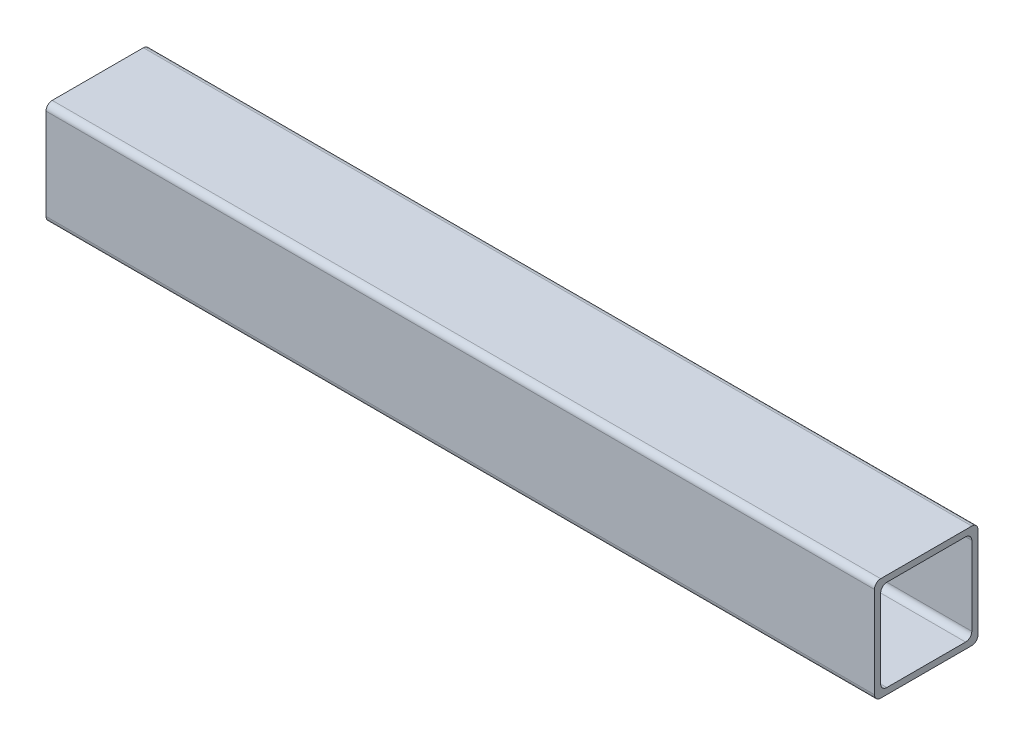
ISO-10303-21;
HEADER;
FILE_DESCRIPTION(('STEP AP214'),'2;1');
FILE_NAME('part.step','',(''),(''),'','','');
FILE_SCHEMA(('AUTOMOTIVE_DESIGN { 1 0 10303 214 1 1 1 1 }'));
ENDSEC;
DATA;
#1=APPLICATION_CONTEXT('core data for automotive mechanical design processes');
#2=APPLICATION_PROTOCOL_DEFINITION('international standard','automotive_design',2000,#1);
#3=PRODUCT_CONTEXT('',#1,'mechanical');
#4=PRODUCT('Part','Part','',(#3));
#5=PRODUCT_RELATED_PRODUCT_CATEGORY('part','',(#4));
#6=PRODUCT_DEFINITION_FORMATION('','',#4);
#7=PRODUCT_DEFINITION_CONTEXT('part definition',#1,'design');
#8=PRODUCT_DEFINITION('design','',#6,#7);
#9=PRODUCT_DEFINITION_SHAPE('','',#8);
#10=(LENGTH_UNIT() NAMED_UNIT(*) SI_UNIT(.MILLI.,.METRE.));
#11=(NAMED_UNIT(*) PLANE_ANGLE_UNIT() SI_UNIT($,.RADIAN.));
#12=(NAMED_UNIT(*) SI_UNIT($,.STERADIAN.) SOLID_ANGLE_UNIT());
#13=UNCERTAINTY_MEASURE_WITH_UNIT(LENGTH_MEASURE(1.E-05),#10,'distance_accuracy_value','');
#14=(GEOMETRIC_REPRESENTATION_CONTEXT(3) GLOBAL_UNCERTAINTY_ASSIGNED_CONTEXT((#13)) GLOBAL_UNIT_ASSIGNED_CONTEXT((#10,
#11,#12)) REPRESENTATION_CONTEXT('',''));
#15=CARTESIAN_POINT('',(0.,0.,0.));
#16=DIRECTION('',(0.,0.,1.));
#17=DIRECTION('',(1.,0.,0.));
#18=AXIS2_PLACEMENT_3D('',#15,#16,#17);
#19=CARTESIAN_POINT('',(200.,23.5,-23.5));
#20=DIRECTION('',(-1.,0.,0.));
#21=DIRECTION('',(0.,0.,1.));
#22=AXIS2_PLACEMENT_3D('',#19,#20,#21);
#23=PLANE('',#22);
#24=CARTESIAN_POINT('',(200.,23.5,-23.5));
#25=DIRECTION('',(1.,0.,0.));
#26=DIRECTION('',(0.,0.,1.));
#27=AXIS2_PLACEMENT_3D('',#24,#25,#26);
#28=CIRCLE('',#27,1.5);
#29=CARTESIAN_POINT('',(200.,23.5,-25.));
#30=VERTEX_POINT('',#29);
#31=CARTESIAN_POINT('',(200.,25.,-23.5));
#32=VERTEX_POINT('',#31);
#33=EDGE_CURVE('E211',#30,#32,#28,.T.);
#34=ORIENTED_EDGE('',*,*,#33,.T.);
#35=DIRECTION('',(0.,0.,1.));
#36=VECTOR('',#35,1.);
#37=CARTESIAN_POINT('',(200.,25.,-1.50000000000001));
#38=LINE('',#37,#36);
#39=CARTESIAN_POINT('',(200.,25.,-1.50000000000001));
#40=VERTEX_POINT('',#39);
#41=EDGE_CURVE('E214',#32,#40,#38,.T.);
#42=ORIENTED_EDGE('',*,*,#41,.T.);
#43=CARTESIAN_POINT('',(200.,23.5,-1.5));
#44=DIRECTION('',(1.,0.,0.));
#45=DIRECTION('',(0.,0.,1.));
#46=AXIS2_PLACEMENT_3D('',#43,#44,#45);
#47=CIRCLE('',#46,1.5);
#48=CARTESIAN_POINT('',(200.,23.5,0.));
#49=VERTEX_POINT('',#48);
#50=EDGE_CURVE('E217',#40,#49,#47,.T.);
#51=ORIENTED_EDGE('',*,*,#50,.T.);
#52=DIRECTION('',(0.,-1.,0.));
#53=VECTOR('',#52,1.);
#54=CARTESIAN_POINT('',(200.,1.50000000000001,0.));
#55=LINE('',#54,#53);
#56=CARTESIAN_POINT('',(200.,1.50000000000001,0.));
#57=VERTEX_POINT('',#56);
#58=EDGE_CURVE('E219',#49,#57,#55,.T.);
#59=ORIENTED_EDGE('',*,*,#58,.T.);
#60=CARTESIAN_POINT('',(200.,1.5,-1.5));
#61=DIRECTION('',(1.,0.,0.));
#62=DIRECTION('',(0.,0.,1.));
#63=AXIS2_PLACEMENT_3D('',#60,#61,#62);
#64=CIRCLE('',#63,1.5);
#65=CARTESIAN_POINT('',(200.,0.,-1.50000000000001));
#66=VERTEX_POINT('',#65);
#67=EDGE_CURVE('E221',#57,#66,#64,.T.);
#68=ORIENTED_EDGE('',*,*,#67,.T.);
#69=DIRECTION('',(0.,0.,-1.));
#70=VECTOR('',#69,1.);
#71=CARTESIAN_POINT('',(200.,0.,-1.50000000000001));
#72=LINE('',#71,#70);
#73=CARTESIAN_POINT('',(200.,0.,-23.5));
#74=VERTEX_POINT('',#73);
#75=EDGE_CURVE('E223',#66,#74,#72,.T.);
#76=ORIENTED_EDGE('',*,*,#75,.T.);
#77=CARTESIAN_POINT('',(200.,1.5,-23.5));
#78=DIRECTION('',(1.,0.,0.));
#79=DIRECTION('',(0.,0.,-1.));
#80=AXIS2_PLACEMENT_3D('',#77,#78,#79);
#81=CIRCLE('',#80,1.5);
#82=CARTESIAN_POINT('',(200.,1.5,-25.));
#83=VERTEX_POINT('',#82);
#84=EDGE_CURVE('E225',#74,#83,#81,.T.);
#85=ORIENTED_EDGE('',*,*,#84,.T.);
#86=DIRECTION('',(0.,1.,0.));
#87=VECTOR('',#86,1.);
#88=CARTESIAN_POINT('',(200.,1.50000000000001,-25.));
#89=LINE('',#88,#87);
#90=EDGE_CURVE('E227',#83,#30,#89,.T.);
#91=ORIENTED_EDGE('',*,*,#90,.T.);
#92=EDGE_LOOP('',(#34,#42,#51,#59,#68,#76,#85,#91));
#93=FACE_BOUND('',#92,.T.);
#94=CARTESIAN_POINT('',(200.,22.,-22.));
#95=DIRECTION('',(1.,0.,0.));
#96=DIRECTION('',(0.,0.,1.));
#97=AXIS2_PLACEMENT_3D('',#94,#95,#96);
#98=CIRCLE('',#97,1.5);
#99=CARTESIAN_POINT('',(200.,22.,-23.5));
#100=VERTEX_POINT('',#99);
#101=CARTESIAN_POINT('',(200.,23.5,-22.));
#102=VERTEX_POINT('',#101);
#103=EDGE_CURVE('E146',#100,#102,#98,.T.);
#104=ORIENTED_EDGE('',*,*,#103,.F.);
#105=DIRECTION('',(0.,1.,0.));
#106=VECTOR('',#105,1.);
#107=CARTESIAN_POINT('',(200.,22.,-23.5));
#108=LINE('',#107,#106);
#109=CARTESIAN_POINT('',(200.,3.,-23.5));
#110=VERTEX_POINT('',#109);
#111=EDGE_CURVE('E179',#110,#100,#108,.T.);
#112=ORIENTED_EDGE('',*,*,#111,.F.);
#113=CARTESIAN_POINT('',(200.,3.,-22.));
#114=DIRECTION('',(1.,0.,0.));
#115=DIRECTION('',(0.,0.,-1.));
#116=AXIS2_PLACEMENT_3D('',#113,#114,#115);
#117=CIRCLE('',#116,1.5);
#118=CARTESIAN_POINT('',(200.,1.5,-22.));
#119=VERTEX_POINT('',#118);
#120=EDGE_CURVE('E177',#119,#110,#117,.T.);
#121=ORIENTED_EDGE('',*,*,#120,.F.);
#122=DIRECTION('',(0.,0.,-1.));
#123=VECTOR('',#122,1.);
#124=CARTESIAN_POINT('',(200.,1.5,-3.00000000000001));
#125=LINE('',#124,#123);
#126=CARTESIAN_POINT('',(200.,1.5,-3.00000000000001));
#127=VERTEX_POINT('',#126);
#128=EDGE_CURVE('E175',#127,#119,#125,.T.);
#129=ORIENTED_EDGE('',*,*,#128,.F.);
#130=CARTESIAN_POINT('',(200.,3.,-3.));
#131=DIRECTION('',(1.,0.,0.));
#132=DIRECTION('',(0.,0.,-1.));
#133=AXIS2_PLACEMENT_3D('',#130,#131,#132);
#134=CIRCLE('',#133,1.5);
#135=CARTESIAN_POINT('',(200.,3.00000000000001,-1.5));
#136=VERTEX_POINT('',#135);
#137=EDGE_CURVE('E173',#136,#127,#134,.T.);
#138=ORIENTED_EDGE('',*,*,#137,.F.);
#139=DIRECTION('',(0.,-1.,0.));
#140=VECTOR('',#139,1.);
#141=CARTESIAN_POINT('',(200.,22.,-1.5));
#142=LINE('',#141,#140);
#143=CARTESIAN_POINT('',(200.,22.,-1.5));
#144=VERTEX_POINT('',#143);
#145=EDGE_CURVE('E169',#144,#136,#142,.T.);
#146=ORIENTED_EDGE('',*,*,#145,.F.);
#147=CARTESIAN_POINT('',(200.,22.,-3.));
#148=DIRECTION('',(1.,0.,0.));
#149=DIRECTION('',(0.,0.,1.));
#150=AXIS2_PLACEMENT_3D('',#147,#148,#149);
#151=CIRCLE('',#150,1.5);
#152=CARTESIAN_POINT('',(200.,23.5,-3.00000000000001));
#153=VERTEX_POINT('',#152);
#154=EDGE_CURVE('E167',#153,#144,#151,.T.);
#155=ORIENTED_EDGE('',*,*,#154,.F.);
#156=DIRECTION('',(0.,0.,1.));
#157=VECTOR('',#156,1.);
#158=CARTESIAN_POINT('',(200.,23.5,-3.00000000000001));
#159=LINE('',#158,#157);
#160=EDGE_CURVE('E154',#102,#153,#159,.T.);
#161=ORIENTED_EDGE('',*,*,#160,.F.);
#162=EDGE_LOOP('',(#104,#112,#121,#129,#138,#146,#155,#161));
#163=FACE_BOUND('',#162,.T.);
#164=ADVANCED_FACE('F33',(#93,#163),#23,.F.);
#165=CARTESIAN_POINT('',(0.,23.5,-23.5));
#166=DIRECTION('',(-1.,0.,0.));
#167=DIRECTION('',(0.,0.,1.));
#168=AXIS2_PLACEMENT_3D('',#165,#166,#167);
#169=PLANE('',#168);
#170=CARTESIAN_POINT('',(0.,23.5,-23.5));
#171=DIRECTION('',(1.,0.,0.));
#172=DIRECTION('',(0.,0.,1.));
#173=AXIS2_PLACEMENT_3D('',#170,#171,#172);
#174=CIRCLE('',#173,1.5);
#175=CARTESIAN_POINT('',(0.,23.5,-25.));
#176=VERTEX_POINT('',#175);
#177=CARTESIAN_POINT('',(0.,25.,-23.5));
#178=VERTEX_POINT('',#177);
#179=EDGE_CURVE('E162',#176,#178,#174,.T.);
#180=ORIENTED_EDGE('',*,*,#179,.F.);
#181=DIRECTION('',(0.,1.,0.));
#182=VECTOR('',#181,1.);
#183=CARTESIAN_POINT('',(0.,1.50000000000001,-25.));
#184=LINE('',#183,#182);
#185=CARTESIAN_POINT('',(0.,1.5,-25.));
#186=VERTEX_POINT('',#185);
#187=EDGE_CURVE('E215',#186,#176,#184,.T.);
#188=ORIENTED_EDGE('',*,*,#187,.F.);
#189=CARTESIAN_POINT('',(0.,1.5,-23.5));
#190=DIRECTION('',(1.,0.,0.));
#191=DIRECTION('',(0.,0.,-1.));
#192=AXIS2_PLACEMENT_3D('',#189,#190,#191);
#193=CIRCLE('',#192,1.5);
#194=CARTESIAN_POINT('',(0.,0.,-23.5));
#195=VERTEX_POINT('',#194);
#196=EDGE_CURVE('E242',#195,#186,#193,.T.);
#197=ORIENTED_EDGE('',*,*,#196,.F.);
#198=DIRECTION('',(0.,0.,-1.));
#199=VECTOR('',#198,1.);
#200=CARTESIAN_POINT('',(0.,0.,-1.50000000000001));
#201=LINE('',#200,#199);
#202=CARTESIAN_POINT('',(0.,0.,-1.50000000000001));
#203=VERTEX_POINT('',#202);
#204=EDGE_CURVE('E240',#203,#195,#201,.T.);
#205=ORIENTED_EDGE('',*,*,#204,.F.);
#206=CARTESIAN_POINT('',(0.,1.5,-1.5));
#207=DIRECTION('',(1.,0.,0.));
#208=DIRECTION('',(0.,0.,1.));
#209=AXIS2_PLACEMENT_3D('',#206,#207,#208);
#210=CIRCLE('',#209,1.5);
#211=CARTESIAN_POINT('',(0.,1.50000000000001,0.));
#212=VERTEX_POINT('',#211);
#213=EDGE_CURVE('E238',#212,#203,#210,.T.);
#214=ORIENTED_EDGE('',*,*,#213,.F.);
#215=DIRECTION('',(0.,-1.,0.));
#216=VECTOR('',#215,1.);
#217=CARTESIAN_POINT('',(0.,1.50000000000001,0.));
#218=LINE('',#217,#216);
#219=CARTESIAN_POINT('',(0.,23.5,0.));
#220=VERTEX_POINT('',#219);
#221=EDGE_CURVE('E236',#220,#212,#218,.T.);
#222=ORIENTED_EDGE('',*,*,#221,.F.);
#223=CARTESIAN_POINT('',(0.,23.5,-1.5));
#224=DIRECTION('',(1.,0.,0.));
#225=DIRECTION('',(0.,0.,1.));
#226=AXIS2_PLACEMENT_3D('',#223,#224,#225);
#227=CIRCLE('',#226,1.5);
#228=CARTESIAN_POINT('',(0.,25.,-1.50000000000001));
#229=VERTEX_POINT('',#228);
#230=EDGE_CURVE('E234',#229,#220,#227,.T.);
#231=ORIENTED_EDGE('',*,*,#230,.F.);
#232=DIRECTION('',(0.,0.,1.));
#233=VECTOR('',#232,1.);
#234=CARTESIAN_POINT('',(0.,25.,-1.50000000000001));
#235=LINE('',#234,#233);
#236=EDGE_CURVE('E232',#178,#229,#235,.T.);
#237=ORIENTED_EDGE('',*,*,#236,.F.);
#238=EDGE_LOOP('',(#180,#188,#197,#205,#214,#222,#231,#237));
#239=FACE_BOUND('',#238,.T.);
#240=DIRECTION('',(0.,1.,0.));
#241=VECTOR('',#240,1.);
#242=CARTESIAN_POINT('',(0.,22.,-23.5));
#243=LINE('',#242,#241);
#244=CARTESIAN_POINT('',(0.,3.,-23.5));
#245=VERTEX_POINT('',#244);
#246=CARTESIAN_POINT('',(0.,22.,-23.5));
#247=VERTEX_POINT('',#246);
#248=EDGE_CURVE('E155',#245,#247,#243,.T.);
#249=ORIENTED_EDGE('',*,*,#248,.T.);
#250=CARTESIAN_POINT('',(0.,22.,-22.));
#251=DIRECTION('',(1.,0.,0.));
#252=DIRECTION('',(0.,0.,1.));
#253=AXIS2_PLACEMENT_3D('',#250,#251,#252);
#254=CIRCLE('',#253,1.5);
#255=CARTESIAN_POINT('',(0.,23.5,-22.));
#256=VERTEX_POINT('',#255);
#257=EDGE_CURVE('E56',#247,#256,#254,.T.);
#258=ORIENTED_EDGE('',*,*,#257,.T.);
#259=DIRECTION('',(0.,0.,1.));
#260=VECTOR('',#259,1.);
#261=CARTESIAN_POINT('',(0.,23.5,-3.00000000000001));
#262=LINE('',#261,#260);
#263=CARTESIAN_POINT('',(0.,23.5,-3.00000000000001));
#264=VERTEX_POINT('',#263);
#265=EDGE_CURVE('E161',#256,#264,#262,.T.);
#266=ORIENTED_EDGE('',*,*,#265,.T.);
#267=CARTESIAN_POINT('',(0.,22.,-3.));
#268=DIRECTION('',(1.,0.,0.));
#269=DIRECTION('',(0.,0.,1.));
#270=AXIS2_PLACEMENT_3D('',#267,#268,#269);
#271=CIRCLE('',#270,1.5);
#272=CARTESIAN_POINT('',(0.,22.,-1.5));
#273=VERTEX_POINT('',#272);
#274=EDGE_CURVE('E183',#264,#273,#271,.T.);
#275=ORIENTED_EDGE('',*,*,#274,.T.);
#276=DIRECTION('',(0.,-1.,0.));
#277=VECTOR('',#276,1.);
#278=CARTESIAN_POINT('',(0.,22.,-1.5));
#279=LINE('',#278,#277);
#280=CARTESIAN_POINT('',(0.,3.00000000000001,-1.5));
#281=VERTEX_POINT('',#280);
#282=EDGE_CURVE('E186',#273,#281,#279,.T.);
#283=ORIENTED_EDGE('',*,*,#282,.T.);
#284=CARTESIAN_POINT('',(0.,3.,-3.));
#285=DIRECTION('',(1.,0.,0.));
#286=DIRECTION('',(0.,0.,-1.));
#287=AXIS2_PLACEMENT_3D('',#284,#285,#286);
#288=CIRCLE('',#287,1.5);
#289=CARTESIAN_POINT('',(0.,1.5,-3.00000000000001));
#290=VERTEX_POINT('',#289);
#291=EDGE_CURVE('E189',#281,#290,#288,.T.);
#292=ORIENTED_EDGE('',*,*,#291,.T.);
#293=DIRECTION('',(0.,0.,-1.));
#294=VECTOR('',#293,1.);
#295=CARTESIAN_POINT('',(0.,1.5,-3.00000000000001));
#296=LINE('',#295,#294);
#297=CARTESIAN_POINT('',(0.,1.5,-22.));
#298=VERTEX_POINT('',#297);
#299=EDGE_CURVE('E192',#290,#298,#296,.T.);
#300=ORIENTED_EDGE('',*,*,#299,.T.);
#301=CARTESIAN_POINT('',(0.,3.,-22.));
#302=DIRECTION('',(1.,0.,0.));
#303=DIRECTION('',(0.,0.,-1.));
#304=AXIS2_PLACEMENT_3D('',#301,#302,#303);
#305=CIRCLE('',#304,1.5);
#306=EDGE_CURVE('E195',#298,#245,#305,.T.);
#307=ORIENTED_EDGE('',*,*,#306,.T.);
#308=EDGE_LOOP('',(#249,#258,#266,#275,#283,#292,#300,#307));
#309=FACE_BOUND('',#308,.T.);
#310=ADVANCED_FACE('F272',(#239,#309),#169,.T.);
#311=CARTESIAN_POINT('',(200.,23.5,-23.5));
#312=DIRECTION('',(-1.,0.,0.));
#313=DIRECTION('',(0.,0.,1.));
#314=AXIS2_PLACEMENT_3D('',#311,#312,#313);
#315=CYLINDRICAL_SURFACE('',#314,1.5);
#316=ORIENTED_EDGE('',*,*,#179,.T.);
#317=DIRECTION('',(-1.,0.,0.));
#318=VECTOR('',#317,1.);
#319=CARTESIAN_POINT('',(200.,25.,-23.5));
#320=LINE('',#319,#318);
#321=EDGE_CURVE('E11',#32,#178,#320,.T.);
#322=ORIENTED_EDGE('',*,*,#321,.F.);
#323=ORIENTED_EDGE('',*,*,#33,.F.);
#324=DIRECTION('',(-1.,0.,0.));
#325=VECTOR('',#324,1.);
#326=CARTESIAN_POINT('',(200.,23.5,-25.));
#327=LINE('',#326,#325);
#328=EDGE_CURVE('E229',#30,#176,#327,.T.);
#329=ORIENTED_EDGE('',*,*,#328,.T.);
#330=EDGE_LOOP('',(#316,#322,#323,#329));
#331=FACE_BOUND('',#330,.T.);
#332=ADVANCED_FACE('F35',(#331),#315,.T.);
#333=CARTESIAN_POINT('',(200.,25.,-1.50000000000001));
#334=DIRECTION('',(0.,-1.,0.));
#335=DIRECTION('',(0.,0.,-1.));
#336=AXIS2_PLACEMENT_3D('',#333,#334,#335);
#337=PLANE('',#336);
#338=ORIENTED_EDGE('',*,*,#236,.T.);
#339=DIRECTION('',(-1.,0.,0.));
#340=VECTOR('',#339,1.);
#341=CARTESIAN_POINT('',(200.,25.,-1.50000000000001));
#342=LINE('',#341,#340);
#343=EDGE_CURVE('E41',#40,#229,#342,.T.);
#344=ORIENTED_EDGE('',*,*,#343,.F.);
#345=ORIENTED_EDGE('',*,*,#41,.F.);
#346=ORIENTED_EDGE('',*,*,#321,.T.);
#347=EDGE_LOOP('',(#338,#344,#345,#346));
#348=FACE_BOUND('',#347,.T.);
#349=ADVANCED_FACE('F289',(#348),#337,.F.);
#350=CARTESIAN_POINT('',(200.,23.5,-1.5));
#351=DIRECTION('',(-1.,0.,0.));
#352=DIRECTION('',(0.,0.,1.));
#353=AXIS2_PLACEMENT_3D('',#350,#351,#352);
#354=CYLINDRICAL_SURFACE('',#353,1.5);
#355=ORIENTED_EDGE('',*,*,#230,.T.);
#356=DIRECTION('',(-1.,0.,0.));
#357=VECTOR('',#356,1.);
#358=CARTESIAN_POINT('',(200.,23.5,0.));
#359=LINE('',#358,#357);
#360=EDGE_CURVE('E259',#49,#220,#359,.T.);
#361=ORIENTED_EDGE('',*,*,#360,.F.);
#362=ORIENTED_EDGE('',*,*,#50,.F.);
#363=ORIENTED_EDGE('',*,*,#343,.T.);
#364=EDGE_LOOP('',(#355,#361,#362,#363));
#365=FACE_BOUND('',#364,.T.);
#366=ADVANCED_FACE('F266',(#365),#354,.T.);
#367=CARTESIAN_POINT('',(200.,1.50000000000001,0.));
#368=DIRECTION('',(0.,0.,-1.));
#369=DIRECTION('',(-1.,0.,0.));
#370=AXIS2_PLACEMENT_3D('',#367,#368,#369);
#371=PLANE('',#370);
#372=ORIENTED_EDGE('',*,*,#221,.T.);
#373=DIRECTION('',(-1.,0.,0.));
#374=VECTOR('',#373,1.);
#375=CARTESIAN_POINT('',(200.,1.50000000000001,0.));
#376=LINE('',#375,#374);
#377=EDGE_CURVE('E256',#57,#212,#376,.T.);
#378=ORIENTED_EDGE('',*,*,#377,.F.);
#379=ORIENTED_EDGE('',*,*,#58,.F.);
#380=ORIENTED_EDGE('',*,*,#360,.T.);
#381=EDGE_LOOP('',(#372,#378,#379,#380));
#382=FACE_BOUND('',#381,.T.);
#383=ADVANCED_FACE('F278',(#382),#371,.F.);
#384=CARTESIAN_POINT('',(200.,1.5,-1.5));
#385=DIRECTION('',(-1.,0.,0.));
#386=DIRECTION('',(0.,0.,1.));
#387=AXIS2_PLACEMENT_3D('',#384,#385,#386);
#388=CYLINDRICAL_SURFACE('',#387,1.5);
#389=ORIENTED_EDGE('',*,*,#213,.T.);
#390=DIRECTION('',(-1.,0.,0.));
#391=VECTOR('',#390,1.);
#392=CARTESIAN_POINT('',(200.,0.,-1.50000000000001));
#393=LINE('',#392,#391);
#394=EDGE_CURVE('E253',#66,#203,#393,.T.);
#395=ORIENTED_EDGE('',*,*,#394,.F.);
#396=ORIENTED_EDGE('',*,*,#67,.F.);
#397=ORIENTED_EDGE('',*,*,#377,.T.);
#398=EDGE_LOOP('',(#389,#395,#396,#397));
#399=FACE_BOUND('',#398,.T.);
#400=ADVANCED_FACE('F282',(#399),#388,.T.);
#401=CARTESIAN_POINT('',(200.,0.,-1.50000000000001));
#402=DIRECTION('',(0.,1.,0.));
#403=DIRECTION('',(0.,0.,1.));
#404=AXIS2_PLACEMENT_3D('',#401,#402,#403);
#405=PLANE('',#404);
#406=ORIENTED_EDGE('',*,*,#204,.T.);
#407=DIRECTION('',(-1.,0.,0.));
#408=VECTOR('',#407,1.);
#409=CARTESIAN_POINT('',(200.,0.,-23.5));
#410=LINE('',#409,#408);
#411=EDGE_CURVE('E250',#74,#195,#410,.T.);
#412=ORIENTED_EDGE('',*,*,#411,.F.);
#413=ORIENTED_EDGE('',*,*,#75,.F.);
#414=ORIENTED_EDGE('',*,*,#394,.T.);
#415=EDGE_LOOP('',(#406,#412,#413,#414));
#416=FACE_BOUND('',#415,.T.);
#417=ADVANCED_FACE('F302',(#416),#405,.F.);
#418=CARTESIAN_POINT('',(200.,1.5,-23.5));
#419=DIRECTION('',(-1.,0.,0.));
#420=DIRECTION('',(0.,0.,1.));
#421=AXIS2_PLACEMENT_3D('',#418,#419,#420);
#422=CYLINDRICAL_SURFACE('',#421,1.5);
#423=ORIENTED_EDGE('',*,*,#196,.T.);
#424=DIRECTION('',(-1.,0.,0.));
#425=VECTOR('',#424,1.);
#426=CARTESIAN_POINT('',(200.,1.5,-25.));
#427=LINE('',#426,#425);
#428=EDGE_CURVE('E247',#83,#186,#427,.T.);
#429=ORIENTED_EDGE('',*,*,#428,.F.);
#430=ORIENTED_EDGE('',*,*,#84,.F.);
#431=ORIENTED_EDGE('',*,*,#411,.T.);
#432=EDGE_LOOP('',(#423,#429,#430,#431));
#433=FACE_BOUND('',#432,.T.);
#434=ADVANCED_FACE('F300',(#433),#422,.T.);
#435=CARTESIAN_POINT('',(200.,1.50000000000001,-25.));
#436=DIRECTION('',(0.,0.,1.));
#437=DIRECTION('',(1.,0.,0.));
#438=AXIS2_PLACEMENT_3D('',#435,#436,#437);
#439=PLANE('',#438);
#440=ORIENTED_EDGE('',*,*,#187,.T.);
#441=ORIENTED_EDGE('',*,*,#328,.F.);
#442=ORIENTED_EDGE('',*,*,#90,.F.);
#443=ORIENTED_EDGE('',*,*,#428,.T.);
#444=EDGE_LOOP('',(#440,#441,#442,#443));
#445=FACE_BOUND('',#444,.T.);
#446=ADVANCED_FACE('F295',(#445),#439,.F.);
#447=CARTESIAN_POINT('',(200.,22.,-22.));
#448=DIRECTION('',(-1.,0.,0.));
#449=DIRECTION('',(0.,0.,1.));
#450=AXIS2_PLACEMENT_3D('',#447,#448,#449);
#451=CYLINDRICAL_SURFACE('',#450,1.5);
#452=ORIENTED_EDGE('',*,*,#257,.F.);
#453=DIRECTION('',(-1.,0.,0.));
#454=VECTOR('',#453,1.);
#455=CARTESIAN_POINT('',(200.,22.,-23.5));
#456=LINE('',#455,#454);
#457=EDGE_CURVE('E150',#100,#247,#456,.T.);
#458=ORIENTED_EDGE('',*,*,#457,.F.);
#459=ORIENTED_EDGE('',*,*,#103,.T.);
#460=DIRECTION('',(-1.,0.,0.));
#461=VECTOR('',#460,1.);
#462=CARTESIAN_POINT('',(200.,23.5,-22.));
#463=LINE('',#462,#461);
#464=EDGE_CURVE('E149',#102,#256,#463,.T.);
#465=ORIENTED_EDGE('',*,*,#464,.T.);
#466=EDGE_LOOP('',(#452,#458,#459,#465));
#467=FACE_BOUND('',#466,.T.);
#468=ADVANCED_FACE('F148',(#467),#451,.F.);
#469=CARTESIAN_POINT('',(200.,23.5,-3.00000000000001));
#470=DIRECTION('',(0.,-1.,0.));
#471=DIRECTION('',(0.,0.,-1.));
#472=AXIS2_PLACEMENT_3D('',#469,#470,#471);
#473=PLANE('',#472);
#474=ORIENTED_EDGE('',*,*,#265,.F.);
#475=ORIENTED_EDGE('',*,*,#464,.F.);
#476=ORIENTED_EDGE('',*,*,#160,.T.);
#477=DIRECTION('',(-1.,0.,0.));
#478=VECTOR('',#477,1.);
#479=CARTESIAN_POINT('',(200.,23.5,-3.00000000000001));
#480=LINE('',#479,#478);
#481=EDGE_CURVE('E163',#153,#264,#480,.T.);
#482=ORIENTED_EDGE('',*,*,#481,.T.);
#483=EDGE_LOOP('',(#474,#475,#476,#482));
#484=FACE_BOUND('',#483,.T.);
#485=ADVANCED_FACE('F158',(#484),#473,.T.);
#486=CARTESIAN_POINT('',(200.,22.,-3.));
#487=DIRECTION('',(-1.,0.,0.));
#488=DIRECTION('',(0.,0.,1.));
#489=AXIS2_PLACEMENT_3D('',#486,#487,#488);
#490=CYLINDRICAL_SURFACE('',#489,1.5);
#491=ORIENTED_EDGE('',*,*,#274,.F.);
#492=ORIENTED_EDGE('',*,*,#481,.F.);
#493=ORIENTED_EDGE('',*,*,#154,.T.);
#494=DIRECTION('',(-1.,0.,0.));
#495=VECTOR('',#494,1.);
#496=CARTESIAN_POINT('',(200.,22.,-1.5));
#497=LINE('',#496,#495);
#498=EDGE_CURVE('E208',#144,#273,#497,.T.);
#499=ORIENTED_EDGE('',*,*,#498,.T.);
#500=EDGE_LOOP('',(#491,#492,#493,#499));
#501=FACE_BOUND('',#500,.T.);
#502=ADVANCED_FACE('F327',(#501),#490,.F.);
#503=CARTESIAN_POINT('',(200.,22.,-1.5));
#504=DIRECTION('',(0.,0.,-1.));
#505=DIRECTION('',(0.,1.,0.));
#506=AXIS2_PLACEMENT_3D('',#503,#504,#505);
#507=PLANE('',#506);
#508=ORIENTED_EDGE('',*,*,#282,.F.);
#509=ORIENTED_EDGE('',*,*,#498,.F.);
#510=ORIENTED_EDGE('',*,*,#145,.T.);
#511=DIRECTION('',(-1.,0.,0.));
#512=VECTOR('',#511,1.);
#513=CARTESIAN_POINT('',(200.,3.00000000000001,-1.5));
#514=LINE('',#513,#512);
#515=EDGE_CURVE('E206',#136,#281,#514,.T.);
#516=ORIENTED_EDGE('',*,*,#515,.T.);
#517=EDGE_LOOP('',(#508,#509,#510,#516));
#518=FACE_BOUND('',#517,.T.);
#519=ADVANCED_FACE('F331',(#518),#507,.T.);
#520=CARTESIAN_POINT('',(200.,3.,-3.));
#521=DIRECTION('',(-1.,0.,0.));
#522=DIRECTION('',(0.,0.,1.));
#523=AXIS2_PLACEMENT_3D('',#520,#521,#522);
#524=CYLINDRICAL_SURFACE('',#523,1.5);
#525=ORIENTED_EDGE('',*,*,#291,.F.);
#526=ORIENTED_EDGE('',*,*,#515,.F.);
#527=ORIENTED_EDGE('',*,*,#137,.T.);
#528=DIRECTION('',(-1.,0.,0.));
#529=VECTOR('',#528,1.);
#530=CARTESIAN_POINT('',(200.,1.5,-3.00000000000001));
#531=LINE('',#530,#529);
#532=EDGE_CURVE('E204',#127,#290,#531,.T.);
#533=ORIENTED_EDGE('',*,*,#532,.T.);
#534=EDGE_LOOP('',(#525,#526,#527,#533));
#535=FACE_BOUND('',#534,.T.);
#536=ADVANCED_FACE('F337',(#535),#524,.F.);
#537=CARTESIAN_POINT('',(200.,1.5,-3.00000000000001));
#538=DIRECTION('',(0.,1.,0.));
#539=DIRECTION('',(0.,0.,1.));
#540=AXIS2_PLACEMENT_3D('',#537,#538,#539);
#541=PLANE('',#540);
#542=ORIENTED_EDGE('',*,*,#299,.F.);
#543=ORIENTED_EDGE('',*,*,#532,.F.);
#544=ORIENTED_EDGE('',*,*,#128,.T.);
#545=DIRECTION('',(-1.,0.,0.));
#546=VECTOR('',#545,1.);
#547=CARTESIAN_POINT('',(200.,1.5,-22.));
#548=LINE('',#547,#546);
#549=EDGE_CURVE('E202',#119,#298,#548,.T.);
#550=ORIENTED_EDGE('',*,*,#549,.T.);
#551=EDGE_LOOP('',(#542,#543,#544,#550));
#552=FACE_BOUND('',#551,.T.);
#553=ADVANCED_FACE('F341',(#552),#541,.T.);
#554=CARTESIAN_POINT('',(200.,3.,-22.));
#555=DIRECTION('',(-1.,0.,0.));
#556=DIRECTION('',(0.,0.,1.));
#557=AXIS2_PLACEMENT_3D('',#554,#555,#556);
#558=CYLINDRICAL_SURFACE('',#557,1.5);
#559=ORIENTED_EDGE('',*,*,#306,.F.);
#560=ORIENTED_EDGE('',*,*,#549,.F.);
#561=ORIENTED_EDGE('',*,*,#120,.T.);
#562=DIRECTION('',(-1.,0.,0.));
#563=VECTOR('',#562,1.);
#564=CARTESIAN_POINT('',(200.,3.,-23.5));
#565=LINE('',#564,#563);
#566=EDGE_CURVE('E48',#110,#245,#565,.T.);
#567=ORIENTED_EDGE('',*,*,#566,.T.);
#568=EDGE_LOOP('',(#559,#560,#561,#567));
#569=FACE_BOUND('',#568,.T.);
#570=ADVANCED_FACE('F345',(#569),#558,.F.);
#571=CARTESIAN_POINT('',(200.,22.,-23.5));
#572=DIRECTION('',(0.,0.,1.));
#573=DIRECTION('',(0.,-1.,0.));
#574=AXIS2_PLACEMENT_3D('',#571,#572,#573);
#575=PLANE('',#574);
#576=ORIENTED_EDGE('',*,*,#248,.F.);
#577=ORIENTED_EDGE('',*,*,#566,.F.);
#578=ORIENTED_EDGE('',*,*,#111,.T.);
#579=ORIENTED_EDGE('',*,*,#457,.T.);
#580=EDGE_LOOP('',(#576,#577,#578,#579));
#581=FACE_BOUND('',#580,.T.);
#582=ADVANCED_FACE('F349',(#581),#575,.T.);
#583=CLOSED_SHELL('',(#164,#310,#332,#349,#366,#383,#400,#417,#434,#446,#468,#485,#502,#519,
#536,#553,#570,#582));
#584=MANIFOLD_SOLID_BREP('B2',#583);
#585=ADVANCED_BREP_SHAPE_REPRESENTATION('',(#18,#584),#14);
#586=SHAPE_DEFINITION_REPRESENTATION(#9,#585);
ENDSEC;
END-ISO-10303-21;
